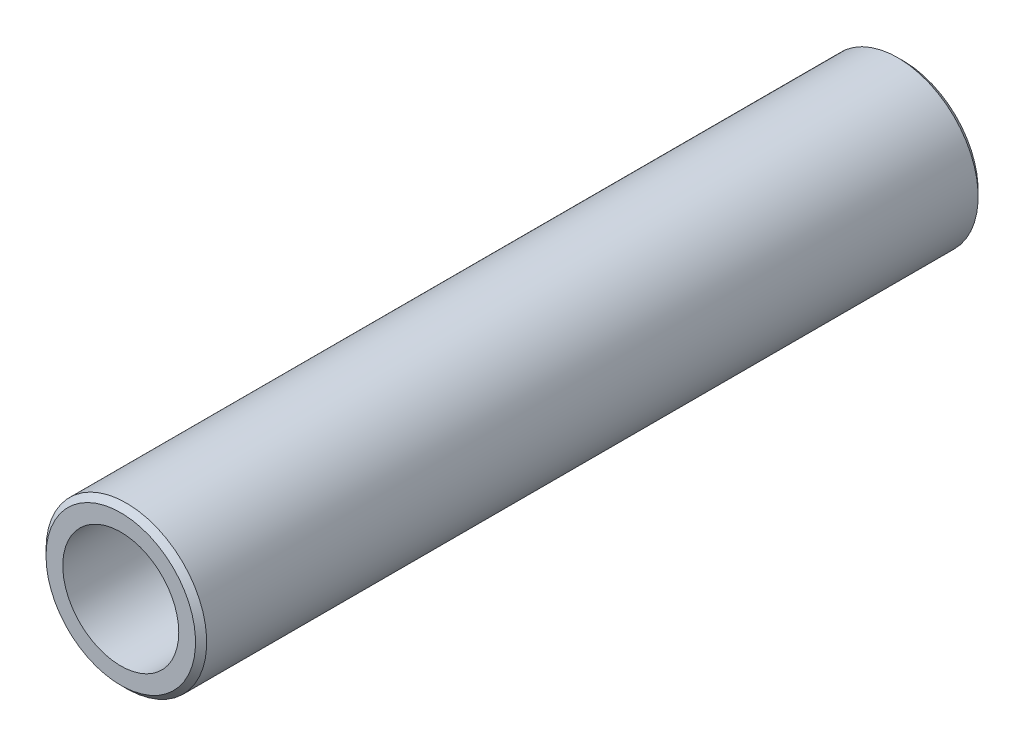
ISO-10303-21;
HEADER;
FILE_DESCRIPTION(('STEP AP214'),'2;1');
FILE_NAME('part.step','',(''),(''),'','','');
FILE_SCHEMA(('AUTOMOTIVE_DESIGN { 1 0 10303 214 1 1 1 1 }'));
ENDSEC;
DATA;
#1=APPLICATION_CONTEXT('core data for automotive mechanical design processes');
#2=APPLICATION_PROTOCOL_DEFINITION('international standard','automotive_design',2000,#1);
#3=PRODUCT_CONTEXT('',#1,'mechanical');
#4=PRODUCT('Part','Part','',(#3));
#5=PRODUCT_RELATED_PRODUCT_CATEGORY('part','',(#4));
#6=PRODUCT_DEFINITION_FORMATION('','',#4);
#7=PRODUCT_DEFINITION_CONTEXT('part definition',#1,'design');
#8=PRODUCT_DEFINITION('design','',#6,#7);
#9=PRODUCT_DEFINITION_SHAPE('','',#8);
#10=(LENGTH_UNIT() NAMED_UNIT(*) SI_UNIT(.MILLI.,.METRE.));
#11=(NAMED_UNIT(*) PLANE_ANGLE_UNIT() SI_UNIT($,.RADIAN.));
#12=(NAMED_UNIT(*) SI_UNIT($,.STERADIAN.) SOLID_ANGLE_UNIT());
#13=UNCERTAINTY_MEASURE_WITH_UNIT(LENGTH_MEASURE(1.E-05),#10,'distance_accuracy_value','');
#14=(GEOMETRIC_REPRESENTATION_CONTEXT(3) GLOBAL_UNCERTAINTY_ASSIGNED_CONTEXT((#13)) GLOBAL_UNIT_ASSIGNED_CONTEXT((#10,
#11,#12)) REPRESENTATION_CONTEXT('',''));
#15=CARTESIAN_POINT('',(0.,0.,0.));
#16=DIRECTION('',(0.,0.,1.));
#17=DIRECTION('',(1.,0.,0.));
#18=AXIS2_PLACEMENT_3D('',#15,#16,#17);
#19=CARTESIAN_POINT('',(5.8,5.8,56.));
#20=DIRECTION('',(0.,0.,-1.));
#21=DIRECTION('',(-1.,0.,0.));
#22=AXIS2_PLACEMENT_3D('',#19,#20,#21);
#23=CYLINDRICAL_SURFACE('',#22,5.75);
#24=CARTESIAN_POINT('',(5.8,5.8,55.6));
#25=DIRECTION('',(0.,0.,-1.));
#26=DIRECTION('',(-1.,0.,0.));
#27=AXIS2_PLACEMENT_3D('',#24,#25,#26);
#28=CIRCLE('',#27,5.75);
#29=CARTESIAN_POINT('',(0.0499999999999988,5.8,55.6));
#30=VERTEX_POINT('',#29);
#31=EDGE_CURVE('E38',#30,#30,#28,.T.);
#32=ORIENTED_EDGE('',*,*,#31,.T.);
#33=EDGE_LOOP('',(#32));
#34=FACE_BOUND('',#33,.T.);
#35=CARTESIAN_POINT('',(5.8,5.8,0.400000000000005));
#36=DIRECTION('',(0.,0.,-1.));
#37=DIRECTION('',(-1.,0.,0.));
#38=AXIS2_PLACEMENT_3D('',#35,#36,#37);
#39=CIRCLE('',#38,5.75);
#40=CARTESIAN_POINT('',(0.0499999999999988,5.8,0.400000000000005));
#41=VERTEX_POINT('',#40);
#42=EDGE_CURVE('E42',#41,#41,#39,.F.);
#43=ORIENTED_EDGE('',*,*,#42,.T.);
#44=EDGE_LOOP('',(#43));
#45=FACE_BOUND('',#44,.T.);
#46=ADVANCED_FACE('F31',(#34,#45),#23,.T.);
#47=CARTESIAN_POINT('',(5.8,5.8,56.));
#48=DIRECTION('',(0.,0.,-1.));
#49=DIRECTION('',(-1.,0.,0.));
#50=AXIS2_PLACEMENT_3D('',#47,#48,#49);
#51=PLANE('',#50);
#52=CARTESIAN_POINT('',(5.8,5.8,56.));
#53=DIRECTION('',(0.,0.,-1.));
#54=DIRECTION('',(-1.,0.,0.));
#55=AXIS2_PLACEMENT_3D('',#52,#53,#54);
#56=CIRCLE('',#55,5.35000000000001);
#57=CARTESIAN_POINT('',(0.449999999999985,5.8,56.));
#58=VERTEX_POINT('',#57);
#59=EDGE_CURVE('E10',#58,#58,#56,.F.);
#60=ORIENTED_EDGE('',*,*,#59,.T.);
#61=EDGE_LOOP('',(#60));
#62=FACE_BOUND('',#61,.T.);
#63=CARTESIAN_POINT('',(5.8,5.8,56.));
#64=DIRECTION('',(0.,0.,1.));
#65=DIRECTION('',(1.,0.,0.));
#66=AXIS2_PLACEMENT_3D('',#63,#64,#65);
#67=CIRCLE('',#66,4.15);
#68=CARTESIAN_POINT('',(9.95,5.8,56.));
#69=VERTEX_POINT('',#68);
#70=EDGE_CURVE('E52',#69,#69,#67,.T.);
#71=ORIENTED_EDGE('',*,*,#70,.F.);
#72=EDGE_LOOP('',(#71));
#73=FACE_BOUND('',#72,.T.);
#74=ADVANCED_FACE('F67',(#62,#73),#51,.F.);
#75=CARTESIAN_POINT('',(5.8,5.8,0.));
#76=DIRECTION('',(0.,0.,-1.));
#77=DIRECTION('',(-1.,0.,0.));
#78=AXIS2_PLACEMENT_3D('',#75,#76,#77);
#79=PLANE('',#78);
#80=CARTESIAN_POINT('',(5.8,5.8,0.));
#81=DIRECTION('',(0.,0.,-1.));
#82=DIRECTION('',(-1.,0.,0.));
#83=AXIS2_PLACEMENT_3D('',#80,#81,#82);
#84=CIRCLE('',#83,5.34999999999999);
#85=CARTESIAN_POINT('',(0.450000000000006,5.8,0.));
#86=VERTEX_POINT('',#85);
#87=EDGE_CURVE('E46',#86,#86,#84,.T.);
#88=ORIENTED_EDGE('',*,*,#87,.T.);
#89=EDGE_LOOP('',(#88));
#90=FACE_BOUND('',#89,.T.);
#91=CARTESIAN_POINT('',(5.8,5.8,0.));
#92=DIRECTION('',(0.,0.,1.));
#93=DIRECTION('',(1.,0.,0.));
#94=AXIS2_PLACEMENT_3D('',#91,#92,#93);
#95=CIRCLE('',#94,4.15);
#96=CARTESIAN_POINT('',(9.95,5.8,0.));
#97=VERTEX_POINT('',#96);
#98=EDGE_CURVE('E51',#97,#97,#95,.T.);
#99=ORIENTED_EDGE('',*,*,#98,.T.);
#100=EDGE_LOOP('',(#99));
#101=FACE_BOUND('',#100,.T.);
#102=ADVANCED_FACE('F58',(#90,#101),#79,.T.);
#103=CARTESIAN_POINT('',(5.8,5.8,0.));
#104=DIRECTION('',(0.,0.,1.));
#105=DIRECTION('',(1.,0.,0.));
#106=AXIS2_PLACEMENT_3D('',#103,#104,#105);
#107=CYLINDRICAL_SURFACE('',#106,4.15);
#108=ORIENTED_EDGE('',*,*,#98,.F.);
#109=EDGE_LOOP('',(#108));
#110=FACE_BOUND('',#109,.T.);
#111=ORIENTED_EDGE('',*,*,#70,.T.);
#112=EDGE_LOOP('',(#111));
#113=FACE_BOUND('',#112,.T.);
#114=ADVANCED_FACE('F60',(#110,#113),#107,.F.);
#115=CARTESIAN_POINT('',(5.8,5.8,0.));
#116=DIRECTION('',(0.,0.,1.));
#117=DIRECTION('',(1.,0.,0.));
#118=AXIS2_PLACEMENT_3D('',#115,#116,#117);
#119=CONICAL_SURFACE('',#118,5.34999999999999,0.785398163397451);
#120=ORIENTED_EDGE('',*,*,#42,.F.);
#121=EDGE_LOOP('',(#120));
#122=FACE_BOUND('',#121,.T.);
#123=ORIENTED_EDGE('',*,*,#87,.F.);
#124=EDGE_LOOP('',(#123));
#125=FACE_BOUND('',#124,.T.);
#126=ADVANCED_FACE('F63',(#122,#125),#119,.T.);
#127=CARTESIAN_POINT('',(5.8,5.8,55.6));
#128=DIRECTION('',(0.,0.,-1.));
#129=DIRECTION('',(-1.,0.,0.));
#130=AXIS2_PLACEMENT_3D('',#127,#128,#129);
#131=CONICAL_SURFACE('',#130,5.75,0.785398163397452);
#132=ORIENTED_EDGE('',*,*,#59,.F.);
#133=EDGE_LOOP('',(#132));
#134=FACE_BOUND('',#133,.T.);
#135=ORIENTED_EDGE('',*,*,#31,.F.);
#136=EDGE_LOOP('',(#135));
#137=FACE_BOUND('',#136,.T.);
#138=ADVANCED_FACE('F33',(#134,#137),#131,.T.);
#139=CLOSED_SHELL('',(#46,#74,#102,#114,#126,#138));
#140=MANIFOLD_SOLID_BREP('B2',#139);
#141=ADVANCED_BREP_SHAPE_REPRESENTATION('',(#18,#140),#14);
#142=SHAPE_DEFINITION_REPRESENTATION(#9,#141);
ENDSEC;
END-ISO-10303-21;
